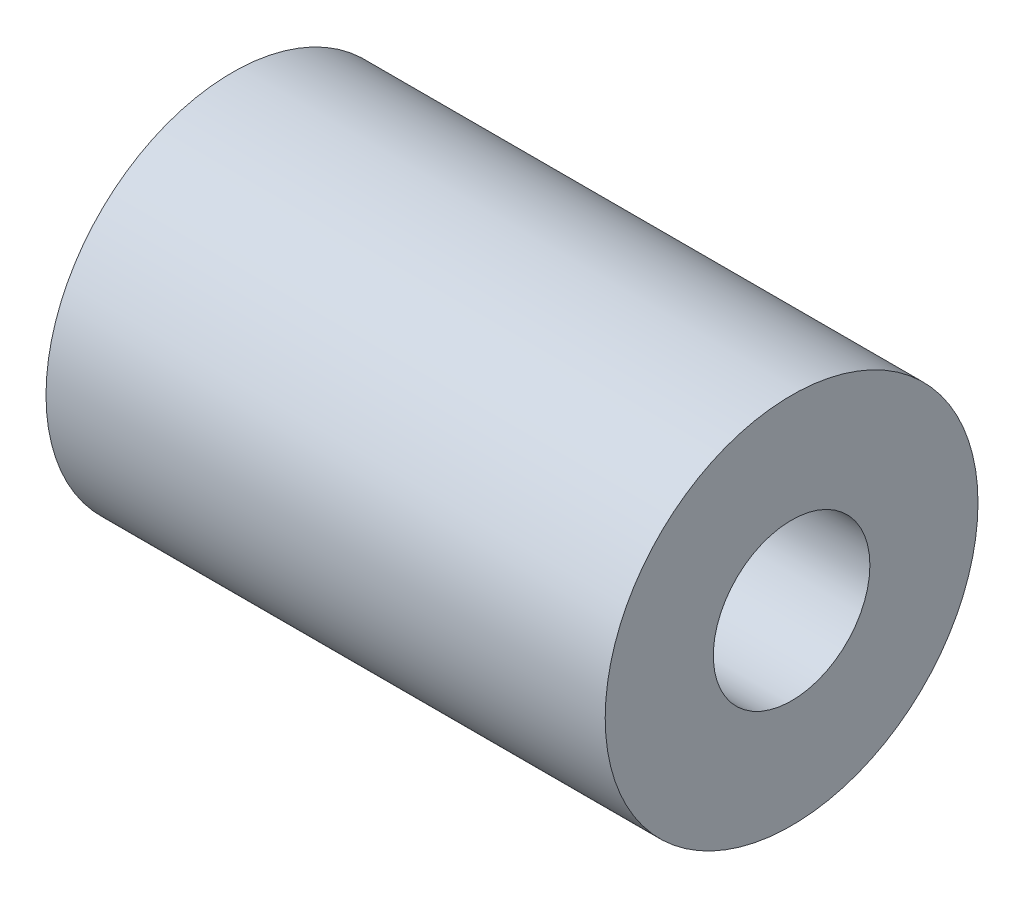
ISO-10303-21;
HEADER;
FILE_DESCRIPTION(('STEP AP214'),'2;1');
FILE_NAME('part.step','',(''),(''),'','','');
FILE_SCHEMA(('AUTOMOTIVE_DESIGN { 1 0 10303 214 1 1 1 1 }'));
ENDSEC;
DATA;
#1=APPLICATION_CONTEXT('core data for automotive mechanical design processes');
#2=APPLICATION_PROTOCOL_DEFINITION('international standard','automotive_design',2000,#1);
#3=PRODUCT_CONTEXT('',#1,'mechanical');
#4=PRODUCT('Part','Part','',(#3));
#5=PRODUCT_RELATED_PRODUCT_CATEGORY('part','',(#4));
#6=PRODUCT_DEFINITION_FORMATION('','',#4);
#7=PRODUCT_DEFINITION_CONTEXT('part definition',#1,'design');
#8=PRODUCT_DEFINITION('design','',#6,#7);
#9=PRODUCT_DEFINITION_SHAPE('','',#8);
#10=(LENGTH_UNIT() NAMED_UNIT(*) SI_UNIT(.MILLI.,.METRE.));
#11=(NAMED_UNIT(*) PLANE_ANGLE_UNIT() SI_UNIT($,.RADIAN.));
#12=(NAMED_UNIT(*) SI_UNIT($,.STERADIAN.) SOLID_ANGLE_UNIT());
#13=UNCERTAINTY_MEASURE_WITH_UNIT(LENGTH_MEASURE(1.E-05),#10,'distance_accuracy_value','');
#14=(GEOMETRIC_REPRESENTATION_CONTEXT(3) GLOBAL_UNCERTAINTY_ASSIGNED_CONTEXT((#13)) GLOBAL_UNIT_ASSIGNED_CONTEXT((#10,
#11,#12)) REPRESENTATION_CONTEXT('',''));
#15=CARTESIAN_POINT('',(0.,0.,0.));
#16=DIRECTION('',(0.,0.,1.));
#17=DIRECTION('',(1.,0.,0.));
#18=AXIS2_PLACEMENT_3D('',#15,#16,#17);
#19=CARTESIAN_POINT('',(-7.5,0.,0.));
#20=DIRECTION('',(1.,0.,0.));
#21=DIRECTION('',(0.,0.,-1.));
#22=AXIS2_PLACEMENT_3D('',#19,#20,#21);
#23=PLANE('',#22);
#24=CARTESIAN_POINT('',(-7.5,0.,0.));
#25=DIRECTION('',(1.,0.,0.));
#26=DIRECTION('',(0.,0.,-1.));
#27=AXIS2_PLACEMENT_3D('',#24,#25,#26);
#28=CIRCLE('',#27,2.1);
#29=CARTESIAN_POINT('',(-7.5,0.,-2.1));
#30=VERTEX_POINT('',#29);
#31=EDGE_CURVE('E44',#30,#30,#28,.T.);
#32=ORIENTED_EDGE('',*,*,#31,.T.);
#33=EDGE_LOOP('',(#32));
#34=FACE_BOUND('',#33,.T.);
#35=CARTESIAN_POINT('',(-7.5,0.,0.));
#36=DIRECTION('',(-1.,0.,0.));
#37=DIRECTION('',(0.,0.,1.));
#38=AXIS2_PLACEMENT_3D('',#35,#36,#37);
#39=CIRCLE('',#38,5.);
#40=CARTESIAN_POINT('',(-7.5,0.,5.));
#41=VERTEX_POINT('',#40);
#42=EDGE_CURVE('E40',#41,#41,#39,.T.);
#43=ORIENTED_EDGE('',*,*,#42,.T.);
#44=EDGE_LOOP('',(#43));
#45=FACE_BOUND('',#44,.T.);
#46=ADVANCED_FACE('F34',(#34,#45),#23,.F.);
#47=CARTESIAN_POINT('',(7.5,5.,0.));
#48=DIRECTION('',(-1.,0.,0.));
#49=DIRECTION('',(0.,0.,1.));
#50=AXIS2_PLACEMENT_3D('',#47,#48,#49);
#51=PLANE('',#50);
#52=CARTESIAN_POINT('',(7.5,0.,0.));
#53=DIRECTION('',(1.,0.,0.));
#54=DIRECTION('',(0.,0.,-1.));
#55=AXIS2_PLACEMENT_3D('',#52,#53,#54);
#56=CIRCLE('',#55,2.09999999999999);
#57=CARTESIAN_POINT('',(7.5,0.,-2.09999999999999));
#58=VERTEX_POINT('',#57);
#59=EDGE_CURVE('E48',#58,#58,#56,.T.);
#60=ORIENTED_EDGE('',*,*,#59,.F.);
#61=EDGE_LOOP('',(#60));
#62=FACE_BOUND('',#61,.T.);
#63=CARTESIAN_POINT('',(7.5,0.,0.));
#64=DIRECTION('',(-1.,0.,0.));
#65=DIRECTION('',(0.,0.,1.));
#66=AXIS2_PLACEMENT_3D('',#63,#64,#65);
#67=CIRCLE('',#66,5.);
#68=CARTESIAN_POINT('',(7.5,0.,5.));
#69=VERTEX_POINT('',#68);
#70=EDGE_CURVE('E10',#69,#69,#67,.T.);
#71=ORIENTED_EDGE('',*,*,#70,.F.);
#72=EDGE_LOOP('',(#71));
#73=FACE_BOUND('',#72,.T.);
#74=ADVANCED_FACE('F56',(#62,#73),#51,.F.);
#75=CARTESIAN_POINT('',(0.,0.,0.));
#76=DIRECTION('',(-1.,0.,0.));
#77=DIRECTION('',(0.,0.,1.));
#78=AXIS2_PLACEMENT_3D('',#75,#76,#77);
#79=CYLINDRICAL_SURFACE('',#78,5.);
#80=ORIENTED_EDGE('',*,*,#42,.F.);
#81=EDGE_LOOP('',(#80));
#82=FACE_BOUND('',#81,.T.);
#83=ORIENTED_EDGE('',*,*,#70,.T.);
#84=EDGE_LOOP('',(#83));
#85=FACE_BOUND('',#84,.T.);
#86=ADVANCED_FACE('F59',(#82,#85),#79,.T.);
#87=CARTESIAN_POINT('',(7.5,0.,0.));
#88=DIRECTION('',(1.,0.,0.));
#89=DIRECTION('',(0.,0.,-1.));
#90=AXIS2_PLACEMENT_3D('',#87,#88,#89);
#91=CYLINDRICAL_SURFACE('',#90,2.09999999999999);
#92=ORIENTED_EDGE('',*,*,#31,.F.);
#93=EDGE_LOOP('',(#92));
#94=FACE_BOUND('',#93,.T.);
#95=ORIENTED_EDGE('',*,*,#59,.T.);
#96=EDGE_LOOP('',(#95));
#97=FACE_BOUND('',#96,.T.);
#98=ADVANCED_FACE('F54',(#94,#97),#91,.F.);
#99=CLOSED_SHELL('',(#46,#74,#86,#98));
#100=MANIFOLD_SOLID_BREP('B2',#99);
#101=ADVANCED_BREP_SHAPE_REPRESENTATION('',(#18,#100),#14);
#102=SHAPE_DEFINITION_REPRESENTATION(#9,#101);
ENDSEC;
END-ISO-10303-21;
